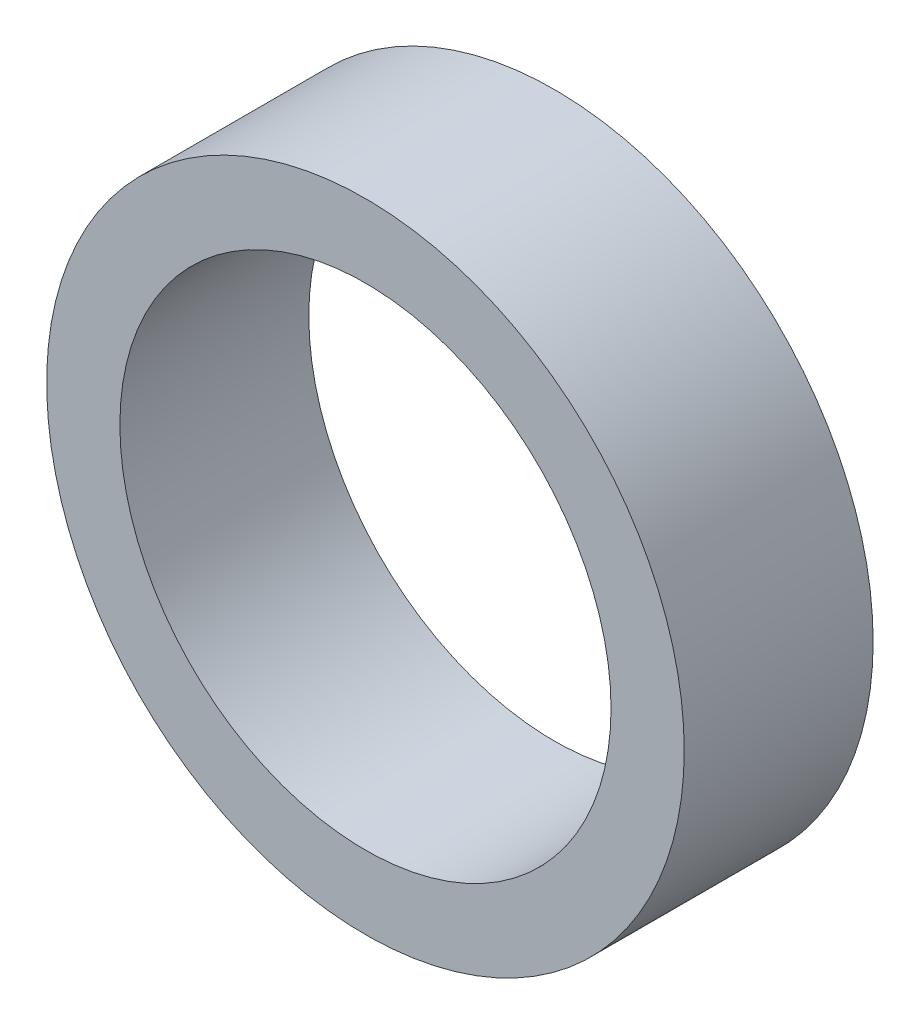
ISO-10303-21;
HEADER;
FILE_DESCRIPTION(('STEP AP214'),'2;1');
FILE_NAME('part.step','',(''),(''),'','','');
FILE_SCHEMA(('AUTOMOTIVE_DESIGN { 1 0 10303 214 1 1 1 1 }'));
ENDSEC;
DATA;
#1=APPLICATION_CONTEXT('core data for automotive mechanical design processes');
#2=APPLICATION_PROTOCOL_DEFINITION('international standard','automotive_design',2000,#1);
#3=PRODUCT_CONTEXT('',#1,'mechanical');
#4=PRODUCT('Part','Part','',(#3));
#5=PRODUCT_RELATED_PRODUCT_CATEGORY('part','',(#4));
#6=PRODUCT_DEFINITION_FORMATION('','',#4);
#7=PRODUCT_DEFINITION_CONTEXT('part definition',#1,'design');
#8=PRODUCT_DEFINITION('design','',#6,#7);
#9=PRODUCT_DEFINITION_SHAPE('','',#8);
#10=(LENGTH_UNIT() NAMED_UNIT(*) SI_UNIT(.MILLI.,.METRE.));
#11=(NAMED_UNIT(*) PLANE_ANGLE_UNIT() SI_UNIT($,.RADIAN.));
#12=(NAMED_UNIT(*) SI_UNIT($,.STERADIAN.) SOLID_ANGLE_UNIT());
#13=UNCERTAINTY_MEASURE_WITH_UNIT(LENGTH_MEASURE(1.E-05),#10,'distance_accuracy_value','');
#14=(GEOMETRIC_REPRESENTATION_CONTEXT(3) GLOBAL_UNCERTAINTY_ASSIGNED_CONTEXT((#13)) GLOBAL_UNIT_ASSIGNED_CONTEXT((#10,
#11,#12)) REPRESENTATION_CONTEXT('',''));
#15=CARTESIAN_POINT('',(0.,0.,0.));
#16=DIRECTION('',(0.,0.,1.));
#17=DIRECTION('',(1.,0.,0.));
#18=AXIS2_PLACEMENT_3D('',#15,#16,#17);
#19=CARTESIAN_POINT('',(0.,0.,4.));
#20=DIRECTION('',(0.,0.,1.));
#21=DIRECTION('',(1.,0.,0.));
#22=AXIS2_PLACEMENT_3D('',#19,#20,#21);
#23=PLANE('',#22);
#24=CARTESIAN_POINT('',(0.,0.,4.));
#25=DIRECTION('',(0.,0.,1.));
#26=DIRECTION('',(1.,0.,0.));
#27=AXIS2_PLACEMENT_3D('',#24,#25,#26);
#28=CIRCLE('',#27,6.75);
#29=CARTESIAN_POINT('',(6.75,0.,4.));
#30=VERTEX_POINT('',#29);
#31=EDGE_CURVE('E10',#30,#30,#28,.T.);
#32=ORIENTED_EDGE('',*,*,#31,.T.);
#33=EDGE_LOOP('',(#32));
#34=FACE_BOUND('',#33,.T.);
#35=CARTESIAN_POINT('',(0.,0.,4.));
#36=DIRECTION('',(0.,0.,1.));
#37=DIRECTION('',(1.,0.,0.));
#38=AXIS2_PLACEMENT_3D('',#35,#36,#37);
#39=CIRCLE('',#38,5.2);
#40=CARTESIAN_POINT('',(5.2,0.,4.));
#41=VERTEX_POINT('',#40);
#42=EDGE_CURVE('E50',#41,#41,#39,.T.);
#43=ORIENTED_EDGE('',*,*,#42,.F.);
#44=EDGE_LOOP('',(#43));
#45=FACE_BOUND('',#44,.T.);
#46=ADVANCED_FACE('F37',(#34,#45),#23,.T.);
#47=CARTESIAN_POINT('',(0.,0.,0.));
#48=DIRECTION('',(0.,0.,1.));
#49=DIRECTION('',(1.,0.,0.));
#50=AXIS2_PLACEMENT_3D('',#47,#48,#49);
#51=PLANE('',#50);
#52=CARTESIAN_POINT('',(0.,0.,0.));
#53=DIRECTION('',(0.,0.,1.));
#54=DIRECTION('',(1.,0.,0.));
#55=AXIS2_PLACEMENT_3D('',#52,#53,#54);
#56=CIRCLE('',#55,6.75);
#57=CARTESIAN_POINT('',(6.75,0.,0.));
#58=VERTEX_POINT('',#57);
#59=EDGE_CURVE('E41',#58,#58,#56,.T.);
#60=ORIENTED_EDGE('',*,*,#59,.F.);
#61=EDGE_LOOP('',(#60));
#62=FACE_BOUND('',#61,.T.);
#63=CARTESIAN_POINT('',(0.,0.,0.));
#64=DIRECTION('',(0.,0.,1.));
#65=DIRECTION('',(1.,0.,0.));
#66=AXIS2_PLACEMENT_3D('',#63,#64,#65);
#67=CIRCLE('',#66,5.2);
#68=CARTESIAN_POINT('',(5.2,0.,0.));
#69=VERTEX_POINT('',#68);
#70=EDGE_CURVE('E52',#69,#69,#67,.T.);
#71=ORIENTED_EDGE('',*,*,#70,.T.);
#72=EDGE_LOOP('',(#71));
#73=FACE_BOUND('',#72,.T.);
#74=ADVANCED_FACE('F64',(#62,#73),#51,.F.);
#75=CARTESIAN_POINT('',(0.,0.,4.));
#76=DIRECTION('',(0.,0.,-1.));
#77=DIRECTION('',(-1.,0.,0.));
#78=AXIS2_PLACEMENT_3D('',#75,#76,#77);
#79=CYLINDRICAL_SURFACE('',#78,6.75);
#80=ORIENTED_EDGE('',*,*,#31,.F.);
#81=EDGE_LOOP('',(#80));
#82=FACE_BOUND('',#81,.T.);
#83=ORIENTED_EDGE('',*,*,#59,.T.);
#84=EDGE_LOOP('',(#83));
#85=FACE_BOUND('',#84,.T.);
#86=ADVANCED_FACE('F39',(#82,#85),#79,.T.);
#87=CARTESIAN_POINT('',(0.,0.,4.));
#88=DIRECTION('',(0.,0.,-1.));
#89=DIRECTION('',(-1.,0.,0.));
#90=AXIS2_PLACEMENT_3D('',#87,#88,#89);
#91=CYLINDRICAL_SURFACE('',#90,5.2);
#92=ORIENTED_EDGE('',*,*,#42,.T.);
#93=EDGE_LOOP('',(#92));
#94=FACE_BOUND('',#93,.T.);
#95=ORIENTED_EDGE('',*,*,#70,.F.);
#96=EDGE_LOOP('',(#95));
#97=FACE_BOUND('',#96,.T.);
#98=ADVANCED_FACE('F60',(#94,#97),#91,.F.);
#99=CLOSED_SHELL('',(#46,#74,#86,#98));
#100=MANIFOLD_SOLID_BREP('B2',#99);
#101=ADVANCED_BREP_SHAPE_REPRESENTATION('',(#18,#100),#14);
#102=SHAPE_DEFINITION_REPRESENTATION(#9,#101);
ENDSEC;
END-ISO-10303-21;
